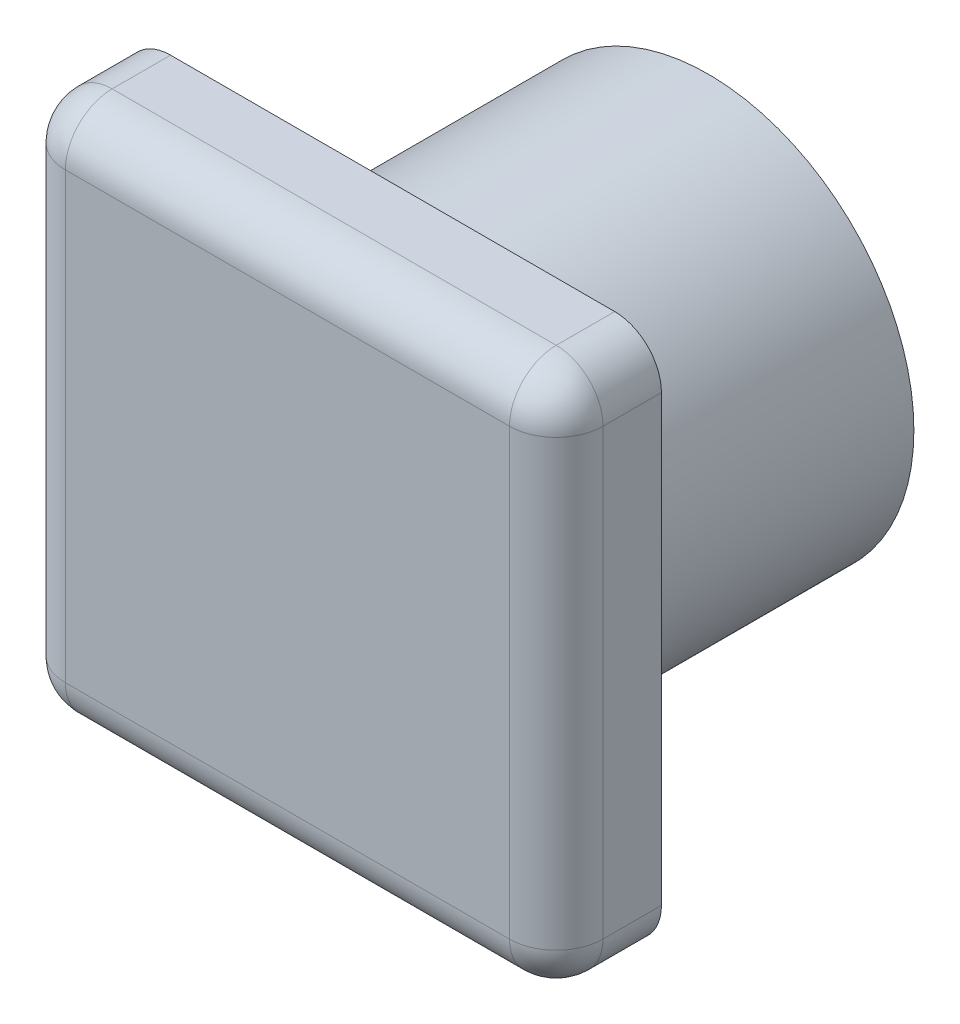
ISO-10303-21;
HEADER;
FILE_DESCRIPTION(('STEP AP214'),'2;1');
FILE_NAME('part.step','',(''),(''),'','','');
FILE_SCHEMA(('AUTOMOTIVE_DESIGN { 1 0 10303 214 1 1 1 1 }'));
ENDSEC;
DATA;
#1=APPLICATION_CONTEXT('core data for automotive mechanical design processes');
#2=APPLICATION_PROTOCOL_DEFINITION('international standard','automotive_design',2000,#1);
#3=PRODUCT_CONTEXT('',#1,'mechanical');
#4=PRODUCT('Part','Part','',(#3));
#5=PRODUCT_RELATED_PRODUCT_CATEGORY('part','',(#4));
#6=PRODUCT_DEFINITION_FORMATION('','',#4);
#7=PRODUCT_DEFINITION_CONTEXT('part definition',#1,'design');
#8=PRODUCT_DEFINITION('design','',#6,#7);
#9=PRODUCT_DEFINITION_SHAPE('','',#8);
#10=(LENGTH_UNIT() NAMED_UNIT(*) SI_UNIT(.MILLI.,.METRE.));
#11=(NAMED_UNIT(*) PLANE_ANGLE_UNIT() SI_UNIT($,.RADIAN.));
#12=(NAMED_UNIT(*) SI_UNIT($,.STERADIAN.) SOLID_ANGLE_UNIT());
#13=UNCERTAINTY_MEASURE_WITH_UNIT(LENGTH_MEASURE(1.E-05),#10,'distance_accuracy_value','');
#14=(GEOMETRIC_REPRESENTATION_CONTEXT(3) GLOBAL_UNCERTAINTY_ASSIGNED_CONTEXT((#13)) GLOBAL_UNIT_ASSIGNED_CONTEXT((#10,
#11,#12)) REPRESENTATION_CONTEXT('',''));
#15=CARTESIAN_POINT('',(0.,0.,0.));
#16=DIRECTION('',(0.,0.,1.));
#17=DIRECTION('',(1.,0.,0.));
#18=AXIS2_PLACEMENT_3D('',#15,#16,#17);
#19=CARTESIAN_POINT('',(0.,0.,13.5));
#20=DIRECTION('',(0.,0.,-1.));
#21=DIRECTION('',(-1.,0.,0.));
#22=AXIS2_PLACEMENT_3D('',#19,#20,#21);
#23=CYLINDRICAL_SURFACE('',#22,8.8);
#24=CARTESIAN_POINT('',(0.,0.,13.5));
#25=DIRECTION('',(0.,0.,1.));
#26=DIRECTION('',(1.,0.,0.));
#27=AXIS2_PLACEMENT_3D('',#24,#25,#26);
#28=CIRCLE('',#27,8.8);
#29=CARTESIAN_POINT('',(8.8,0.,13.5));
#30=VERTEX_POINT('',#29);
#31=EDGE_CURVE('E140',#30,#30,#28,.T.);
#32=ORIENTED_EDGE('',*,*,#31,.F.);
#33=EDGE_LOOP('',(#32));
#34=FACE_BOUND('',#33,.T.);
#35=CARTESIAN_POINT('',(0.,0.,0.));
#36=DIRECTION('',(0.,0.,1.));
#37=DIRECTION('',(1.,0.,0.));
#38=AXIS2_PLACEMENT_3D('',#35,#36,#37);
#39=CIRCLE('',#38,8.8);
#40=CARTESIAN_POINT('',(8.8,0.,0.));
#41=VERTEX_POINT('',#40);
#42=EDGE_CURVE('E212',#41,#41,#39,.T.);
#43=ORIENTED_EDGE('',*,*,#42,.T.);
#44=EDGE_LOOP('',(#43));
#45=FACE_BOUND('',#44,.T.);
#46=ADVANCED_FACE('F33',(#34,#45),#23,.T.);
#47=CARTESIAN_POINT('',(0.,0.,0.));
#48=DIRECTION('',(0.,0.,1.));
#49=DIRECTION('',(1.,0.,0.));
#50=AXIS2_PLACEMENT_3D('',#47,#48,#49);
#51=PLANE('',#50);
#52=ORIENTED_EDGE('',*,*,#42,.F.);
#53=EDGE_LOOP('',(#52));
#54=FACE_BOUND('',#53,.T.);
#55=ADVANCED_FACE('F259',(#54),#51,.F.);
#56=CARTESIAN_POINT('',(11.5,-11.5,18.));
#57=DIRECTION('',(-1.,0.,0.));
#58=DIRECTION('',(0.,0.,1.));
#59=AXIS2_PLACEMENT_3D('',#56,#57,#58);
#60=PLANE('',#59);
#61=DIRECTION('',(0.,1.,0.));
#62=VECTOR('',#61,1.);
#63=CARTESIAN_POINT('',(11.5,-11.5,16.));
#64=LINE('',#63,#62);
#65=CARTESIAN_POINT('',(11.5,9.5,16.));
#66=VERTEX_POINT('',#65);
#67=CARTESIAN_POINT('',(11.5,-9.5,16.));
#68=VERTEX_POINT('',#67);
#69=EDGE_CURVE('E50',#66,#68,#64,.F.);
#70=ORIENTED_EDGE('',*,*,#69,.T.);
#71=DIRECTION('',(0.,0.,-1.));
#72=VECTOR('',#71,1.);
#73=CARTESIAN_POINT('',(11.5,-9.5,18.));
#74=LINE('',#73,#72);
#75=CARTESIAN_POINT('',(11.5,-9.5,13.5));
#76=VERTEX_POINT('',#75);
#77=EDGE_CURVE('E169',#68,#76,#74,.T.);
#78=ORIENTED_EDGE('',*,*,#77,.T.);
#79=DIRECTION('',(0.,1.,0.));
#80=VECTOR('',#79,1.);
#81=CARTESIAN_POINT('',(11.5,-11.5,13.5));
#82=LINE('',#81,#80);
#83=CARTESIAN_POINT('',(11.5,9.5,13.5));
#84=VERTEX_POINT('',#83);
#85=EDGE_CURVE('E198',#76,#84,#82,.T.);
#86=ORIENTED_EDGE('',*,*,#85,.T.);
#87=DIRECTION('',(0.,0.,-1.));
#88=VECTOR('',#87,1.);
#89=CARTESIAN_POINT('',(11.5,9.5,18.));
#90=LINE('',#89,#88);
#91=EDGE_CURVE('E55',#84,#66,#90,.F.);
#92=ORIENTED_EDGE('',*,*,#91,.T.);
#93=EDGE_LOOP('',(#70,#78,#86,#92));
#94=FACE_BOUND('',#93,.T.);
#95=ADVANCED_FACE('F240',(#94),#60,.F.);
#96=CARTESIAN_POINT('',(-11.5,11.5,18.));
#97=DIRECTION('',(0.,-1.,0.));
#98=DIRECTION('',(0.,0.,-1.));
#99=AXIS2_PLACEMENT_3D('',#96,#97,#98);
#100=PLANE('',#99);
#101=DIRECTION('',(-1.,0.,0.));
#102=VECTOR('',#101,1.);
#103=CARTESIAN_POINT('',(-11.5,11.5,13.5));
#104=LINE('',#103,#102);
#105=CARTESIAN_POINT('',(9.5,11.5,13.5));
#106=VERTEX_POINT('',#105);
#107=CARTESIAN_POINT('',(-9.5,11.5,13.5));
#108=VERTEX_POINT('',#107);
#109=EDGE_CURVE('E200',#106,#108,#104,.T.);
#110=ORIENTED_EDGE('',*,*,#109,.T.);
#111=DIRECTION('',(0.,0.,-1.));
#112=VECTOR('',#111,1.);
#113=CARTESIAN_POINT('',(-9.5,11.5,18.));
#114=LINE('',#113,#112);
#115=CARTESIAN_POINT('',(-9.5,11.5,16.));
#116=VERTEX_POINT('',#115);
#117=EDGE_CURVE('E165',#108,#116,#114,.F.);
#118=ORIENTED_EDGE('',*,*,#117,.T.);
#119=DIRECTION('',(-1.,0.,0.));
#120=VECTOR('',#119,1.);
#121=CARTESIAN_POINT('',(-11.5,11.5,16.));
#122=LINE('',#121,#120);
#123=CARTESIAN_POINT('',(9.5,11.5,16.));
#124=VERTEX_POINT('',#123);
#125=EDGE_CURVE('E163',#116,#124,#122,.F.);
#126=ORIENTED_EDGE('',*,*,#125,.T.);
#127=DIRECTION('',(0.,0.,-1.));
#128=VECTOR('',#127,1.);
#129=CARTESIAN_POINT('',(9.5,11.5,18.));
#130=LINE('',#129,#128);
#131=EDGE_CURVE('E161',#124,#106,#130,.T.);
#132=ORIENTED_EDGE('',*,*,#131,.T.);
#133=EDGE_LOOP('',(#110,#118,#126,#132));
#134=FACE_BOUND('',#133,.T.);
#135=ADVANCED_FACE('F382',(#134),#100,.F.);
#136=CARTESIAN_POINT('',(-11.5,-11.5,18.));
#137=DIRECTION('',(1.,0.,0.));
#138=DIRECTION('',(0.,0.,-1.));
#139=AXIS2_PLACEMENT_3D('',#136,#137,#138);
#140=PLANE('',#139);
#141=DIRECTION('',(0.,-1.,0.));
#142=VECTOR('',#141,1.);
#143=CARTESIAN_POINT('',(-11.5,-11.5,16.));
#144=LINE('',#143,#142);
#145=CARTESIAN_POINT('',(-11.5,-9.5,16.));
#146=VERTEX_POINT('',#145);
#147=CARTESIAN_POINT('',(-11.5,9.5,16.));
#148=VERTEX_POINT('',#147);
#149=EDGE_CURVE('E157',#146,#148,#144,.F.);
#150=ORIENTED_EDGE('',*,*,#149,.T.);
#151=DIRECTION('',(0.,0.,-1.));
#152=VECTOR('',#151,1.);
#153=CARTESIAN_POINT('',(-11.5,9.5,18.));
#154=LINE('',#153,#152);
#155=CARTESIAN_POINT('',(-11.5,9.5,13.5));
#156=VERTEX_POINT('',#155);
#157=EDGE_CURVE('E159',#148,#156,#154,.T.);
#158=ORIENTED_EDGE('',*,*,#157,.T.);
#159=DIRECTION('',(0.,-1.,0.));
#160=VECTOR('',#159,1.);
#161=CARTESIAN_POINT('',(-11.5,-11.5,13.5));
#162=LINE('',#161,#160);
#163=CARTESIAN_POINT('',(-11.5,-9.5,13.5));
#164=VERTEX_POINT('',#163);
#165=EDGE_CURVE('E204',#156,#164,#162,.T.);
#166=ORIENTED_EDGE('',*,*,#165,.T.);
#167=DIRECTION('',(0.,0.,-1.));
#168=VECTOR('',#167,1.);
#169=CARTESIAN_POINT('',(-11.5,-9.5,18.));
#170=LINE('',#169,#168);
#171=EDGE_CURVE('E155',#164,#146,#170,.F.);
#172=ORIENTED_EDGE('',*,*,#171,.T.);
#173=EDGE_LOOP('',(#150,#158,#166,#172));
#174=FACE_BOUND('',#173,.T.);
#175=ADVANCED_FACE('F374',(#174),#140,.F.);
#176=CARTESIAN_POINT('',(-11.5,-11.5,18.));
#177=DIRECTION('',(0.,1.,0.));
#178=DIRECTION('',(0.,0.,1.));
#179=AXIS2_PLACEMENT_3D('',#176,#177,#178);
#180=PLANE('',#179);
#181=DIRECTION('',(1.,0.,0.));
#182=VECTOR('',#181,1.);
#183=CARTESIAN_POINT('',(-11.5,-11.5,13.5));
#184=LINE('',#183,#182);
#185=CARTESIAN_POINT('',(-9.5,-11.5,13.5));
#186=VERTEX_POINT('',#185);
#187=CARTESIAN_POINT('',(9.5,-11.5,13.5));
#188=VERTEX_POINT('',#187);
#189=EDGE_CURVE('E209',#186,#188,#184,.T.);
#190=ORIENTED_EDGE('',*,*,#189,.T.);
#191=DIRECTION('',(0.,0.,-1.));
#192=VECTOR('',#191,1.);
#193=CARTESIAN_POINT('',(9.5,-11.5,18.));
#194=LINE('',#193,#192);
#195=CARTESIAN_POINT('',(9.5,-11.5,16.));
#196=VERTEX_POINT('',#195);
#197=EDGE_CURVE('E153',#188,#196,#194,.F.);
#198=ORIENTED_EDGE('',*,*,#197,.T.);
#199=DIRECTION('',(1.,0.,0.));
#200=VECTOR('',#199,1.);
#201=CARTESIAN_POINT('',(-11.5,-11.5,16.));
#202=LINE('',#201,#200);
#203=CARTESIAN_POINT('',(-9.5,-11.5,16.));
#204=VERTEX_POINT('',#203);
#205=EDGE_CURVE('E118',#196,#204,#202,.F.);
#206=ORIENTED_EDGE('',*,*,#205,.T.);
#207=DIRECTION('',(0.,0.,-1.));
#208=VECTOR('',#207,1.);
#209=CARTESIAN_POINT('',(-9.5,-11.5,18.));
#210=LINE('',#209,#208);
#211=EDGE_CURVE('E146',#204,#186,#210,.T.);
#212=ORIENTED_EDGE('',*,*,#211,.T.);
#213=EDGE_LOOP('',(#190,#198,#206,#212));
#214=FACE_BOUND('',#213,.T.);
#215=ADVANCED_FACE('F235',(#214),#180,.F.);
#216=CARTESIAN_POINT('',(0.,0.,18.));
#217=DIRECTION('',(0.,0.,-1.));
#218=DIRECTION('',(-1.,0.,0.));
#219=AXIS2_PLACEMENT_3D('',#216,#217,#218);
#220=PLANE('',#219);
#221=DIRECTION('',(0.,-1.,0.));
#222=VECTOR('',#221,1.);
#223=CARTESIAN_POINT('',(-9.5,0.,18.));
#224=LINE('',#223,#222);
#225=CARTESIAN_POINT('',(-9.5,9.5,18.));
#226=VERTEX_POINT('',#225);
#227=CARTESIAN_POINT('',(-9.5,-9.5,18.));
#228=VERTEX_POINT('',#227);
#229=EDGE_CURVE('E144',#226,#228,#224,.T.);
#230=ORIENTED_EDGE('',*,*,#229,.T.);
#231=DIRECTION('',(1.,0.,0.));
#232=VECTOR('',#231,1.);
#233=CARTESIAN_POINT('',(0.,-9.5,18.));
#234=LINE('',#233,#232);
#235=CARTESIAN_POINT('',(9.5,-9.5,18.));
#236=VERTEX_POINT('',#235);
#237=EDGE_CURVE('E116',#228,#236,#234,.T.);
#238=ORIENTED_EDGE('',*,*,#237,.T.);
#239=DIRECTION('',(0.,1.,0.));
#240=VECTOR('',#239,1.);
#241=CARTESIAN_POINT('',(9.5,0.,18.));
#242=LINE('',#241,#240);
#243=CARTESIAN_POINT('',(9.5,9.5,18.));
#244=VERTEX_POINT('',#243);
#245=EDGE_CURVE('E133',#236,#244,#242,.T.);
#246=ORIENTED_EDGE('',*,*,#245,.T.);
#247=DIRECTION('',(-1.,0.,0.));
#248=VECTOR('',#247,1.);
#249=CARTESIAN_POINT('',(0.,9.5,18.));
#250=LINE('',#249,#248);
#251=EDGE_CURVE('E139',#244,#226,#250,.T.);
#252=ORIENTED_EDGE('',*,*,#251,.T.);
#253=EDGE_LOOP('',(#230,#238,#246,#252));
#254=FACE_BOUND('',#253,.T.);
#255=ADVANCED_FACE('F142',(#254),#220,.F.);
#256=CARTESIAN_POINT('',(0.,0.,13.5));
#257=DIRECTION('',(0.,0.,-1.));
#258=DIRECTION('',(-1.,0.,0.));
#259=AXIS2_PLACEMENT_3D('',#256,#257,#258);
#260=PLANE('',#259);
#261=ORIENTED_EDGE('',*,*,#31,.T.);
#262=EDGE_LOOP('',(#261));
#263=FACE_BOUND('',#262,.T.);
#264=ORIENTED_EDGE('',*,*,#85,.F.);
#265=CARTESIAN_POINT('',(9.5,-9.5,13.5));
#266=DIRECTION('',(0.,0.,-1.));
#267=DIRECTION('',(-1.,0.,0.));
#268=AXIS2_PLACEMENT_3D('',#265,#266,#267);
#269=CIRCLE('',#268,2.);
#270=EDGE_CURVE('E11',#76,#188,#269,.T.);
#271=ORIENTED_EDGE('',*,*,#270,.T.);
#272=ORIENTED_EDGE('',*,*,#189,.F.);
#273=CARTESIAN_POINT('',(-9.5,-9.5,13.5));
#274=DIRECTION('',(0.,0.,-1.));
#275=DIRECTION('',(-1.,0.,0.));
#276=AXIS2_PLACEMENT_3D('',#273,#274,#275);
#277=CIRCLE('',#276,2.);
#278=EDGE_CURVE('E173',#186,#164,#277,.T.);
#279=ORIENTED_EDGE('',*,*,#278,.T.);
#280=ORIENTED_EDGE('',*,*,#165,.F.);
#281=CARTESIAN_POINT('',(-9.5,9.5,13.5));
#282=DIRECTION('',(0.,0.,-1.));
#283=DIRECTION('',(-1.,0.,0.));
#284=AXIS2_PLACEMENT_3D('',#281,#282,#283);
#285=CIRCLE('',#284,2.);
#286=EDGE_CURVE('E42',#156,#108,#285,.T.);
#287=ORIENTED_EDGE('',*,*,#286,.T.);
#288=ORIENTED_EDGE('',*,*,#109,.F.);
#289=CARTESIAN_POINT('',(9.5,9.5,13.5));
#290=DIRECTION('',(0.,0.,-1.));
#291=DIRECTION('',(-1.,0.,0.));
#292=AXIS2_PLACEMENT_3D('',#289,#290,#291);
#293=CIRCLE('',#292,2.);
#294=EDGE_CURVE('E171',#106,#84,#293,.T.);
#295=ORIENTED_EDGE('',*,*,#294,.T.);
#296=EDGE_LOOP('',(#264,#271,#272,#279,#280,#287,#288,#295));
#297=FACE_BOUND('',#296,.T.);
#298=ADVANCED_FACE('F242',(#263,#297),#260,.T.);
#299=CARTESIAN_POINT('',(-9.5,9.5,18.));
#300=DIRECTION('',(0.,0.,-1.));
#301=DIRECTION('',(-1.,0.,0.));
#302=AXIS2_PLACEMENT_3D('',#299,#300,#301);
#303=CYLINDRICAL_SURFACE('',#302,2.);
#304=ORIENTED_EDGE('',*,*,#286,.F.);
#305=ORIENTED_EDGE('',*,*,#157,.F.);
#306=CARTESIAN_POINT('',(-9.5,9.5,16.));
#307=DIRECTION('',(0.,0.,1.));
#308=DIRECTION('',(1.,0.,0.));
#309=AXIS2_PLACEMENT_3D('',#306,#307,#308);
#310=CIRCLE('',#309,2.);
#311=EDGE_CURVE('E37',#116,#148,#310,.T.);
#312=ORIENTED_EDGE('',*,*,#311,.F.);
#313=ORIENTED_EDGE('',*,*,#117,.F.);
#314=EDGE_LOOP('',(#304,#305,#312,#313));
#315=FACE_BOUND('',#314,.T.);
#316=ADVANCED_FACE('F35',(#315),#303,.T.);
#317=CARTESIAN_POINT('',(0.,9.5,16.));
#318=DIRECTION('',(-1.,0.,0.));
#319=DIRECTION('',(0.,0.,1.));
#320=AXIS2_PLACEMENT_3D('',#317,#318,#319);
#321=CYLINDRICAL_SURFACE('',#320,2.);
#322=CARTESIAN_POINT('',(9.5,9.5,16.));
#323=DIRECTION('',(1.,0.,0.));
#324=DIRECTION('',(0.,0.,-1.));
#325=AXIS2_PLACEMENT_3D('',#322,#323,#324);
#326=CIRCLE('',#325,2.);
#327=EDGE_CURVE('E190',#124,#244,#326,.T.);
#328=ORIENTED_EDGE('',*,*,#327,.F.);
#329=ORIENTED_EDGE('',*,*,#125,.F.);
#330=CARTESIAN_POINT('',(-9.5,9.5,16.));
#331=DIRECTION('',(-1.,0.,0.));
#332=DIRECTION('',(0.,0.,1.));
#333=AXIS2_PLACEMENT_3D('',#330,#331,#332);
#334=CIRCLE('',#333,2.);
#335=EDGE_CURVE('E192',#226,#116,#334,.T.);
#336=ORIENTED_EDGE('',*,*,#335,.F.);
#337=ORIENTED_EDGE('',*,*,#251,.F.);
#338=EDGE_LOOP('',(#328,#329,#336,#337));
#339=FACE_BOUND('',#338,.T.);
#340=ADVANCED_FACE('F219',(#339),#321,.T.);
#341=CARTESIAN_POINT('',(9.5,9.5,18.));
#342=DIRECTION('',(0.,0.,-1.));
#343=DIRECTION('',(-1.,0.,0.));
#344=AXIS2_PLACEMENT_3D('',#341,#342,#343);
#345=CYLINDRICAL_SURFACE('',#344,2.);
#346=ORIENTED_EDGE('',*,*,#294,.F.);
#347=ORIENTED_EDGE('',*,*,#131,.F.);
#348=CARTESIAN_POINT('',(9.5,9.5,16.));
#349=DIRECTION('',(0.,0.,1.));
#350=DIRECTION('',(1.,0.,0.));
#351=AXIS2_PLACEMENT_3D('',#348,#349,#350);
#352=CIRCLE('',#351,2.);
#353=EDGE_CURVE('E187',#66,#124,#352,.T.);
#354=ORIENTED_EDGE('',*,*,#353,.F.);
#355=ORIENTED_EDGE('',*,*,#91,.F.);
#356=EDGE_LOOP('',(#346,#347,#354,#355));
#357=FACE_BOUND('',#356,.T.);
#358=ADVANCED_FACE('F247',(#357),#345,.T.);
#359=CARTESIAN_POINT('',(-9.5,9.5,16.));
#360=DIRECTION('',(0.,0.,1.));
#361=DIRECTION('',(1.,0.,0.));
#362=AXIS2_PLACEMENT_3D('',#359,#360,#361);
#363=SPHERICAL_SURFACE('',#362,2.);
#364=ORIENTED_EDGE('',*,*,#335,.T.);
#365=ORIENTED_EDGE('',*,*,#311,.T.);
#366=CARTESIAN_POINT('',(-9.5,9.5,16.));
#367=DIRECTION('',(0.,1.,0.));
#368=DIRECTION('',(0.,0.,1.));
#369=AXIS2_PLACEMENT_3D('',#366,#367,#368);
#370=CIRCLE('',#369,2.);
#371=EDGE_CURVE('E184',#226,#148,#370,.F.);
#372=ORIENTED_EDGE('',*,*,#371,.F.);
#373=EDGE_LOOP('',(#364,#365,#372));
#374=FACE_BOUND('',#373,.T.);
#375=ADVANCED_FACE('F220',(#374),#363,.T.);
#376=CARTESIAN_POINT('',(9.5,9.5,16.));
#377=DIRECTION('',(0.,0.,1.));
#378=DIRECTION('',(1.,0.,0.));
#379=AXIS2_PLACEMENT_3D('',#376,#377,#378);
#380=SPHERICAL_SURFACE('',#379,2.);
#381=ORIENTED_EDGE('',*,*,#353,.T.);
#382=ORIENTED_EDGE('',*,*,#327,.T.);
#383=CARTESIAN_POINT('',(9.5,9.5,16.));
#384=DIRECTION('',(0.,1.,0.));
#385=DIRECTION('',(0.,0.,1.));
#386=AXIS2_PLACEMENT_3D('',#383,#384,#385);
#387=CIRCLE('',#386,2.);
#388=EDGE_CURVE('E136',#66,#244,#387,.F.);
#389=ORIENTED_EDGE('',*,*,#388,.F.);
#390=EDGE_LOOP('',(#381,#382,#389));
#391=FACE_BOUND('',#390,.T.);
#392=ADVANCED_FACE('F249',(#391),#380,.T.);
#393=CARTESIAN_POINT('',(-9.5,-9.5,18.));
#394=DIRECTION('',(0.,0.,-1.));
#395=DIRECTION('',(-1.,0.,0.));
#396=AXIS2_PLACEMENT_3D('',#393,#394,#395);
#397=CYLINDRICAL_SURFACE('',#396,2.);
#398=ORIENTED_EDGE('',*,*,#278,.F.);
#399=ORIENTED_EDGE('',*,*,#211,.F.);
#400=CARTESIAN_POINT('',(-9.5,-9.5,16.));
#401=DIRECTION('',(0.,0.,1.));
#402=DIRECTION('',(1.,0.,0.));
#403=AXIS2_PLACEMENT_3D('',#400,#401,#402);
#404=CIRCLE('',#403,2.);
#405=EDGE_CURVE('E180',#146,#204,#404,.T.);
#406=ORIENTED_EDGE('',*,*,#405,.F.);
#407=ORIENTED_EDGE('',*,*,#171,.F.);
#408=EDGE_LOOP('',(#398,#399,#406,#407));
#409=FACE_BOUND('',#408,.T.);
#410=ADVANCED_FACE('F232',(#409),#397,.T.);
#411=CARTESIAN_POINT('',(-9.5,0.,16.));
#412=DIRECTION('',(0.,-1.,0.));
#413=DIRECTION('',(0.,0.,-1.));
#414=AXIS2_PLACEMENT_3D('',#411,#412,#413);
#415=CYLINDRICAL_SURFACE('',#414,2.);
#416=ORIENTED_EDGE('',*,*,#371,.T.);
#417=ORIENTED_EDGE('',*,*,#149,.F.);
#418=CARTESIAN_POINT('',(-9.5,-9.5,16.));
#419=DIRECTION('',(0.,-1.,0.));
#420=DIRECTION('',(0.,0.,-1.));
#421=AXIS2_PLACEMENT_3D('',#418,#419,#420);
#422=CIRCLE('',#421,2.);
#423=EDGE_CURVE('E130',#228,#146,#422,.T.);
#424=ORIENTED_EDGE('',*,*,#423,.F.);
#425=ORIENTED_EDGE('',*,*,#229,.F.);
#426=EDGE_LOOP('',(#416,#417,#424,#425));
#427=FACE_BOUND('',#426,.T.);
#428=ADVANCED_FACE('F223',(#427),#415,.T.);
#429=CARTESIAN_POINT('',(9.5,0.,16.));
#430=DIRECTION('',(0.,1.,0.));
#431=DIRECTION('',(0.,0.,1.));
#432=AXIS2_PLACEMENT_3D('',#429,#430,#431);
#433=CYLINDRICAL_SURFACE('',#432,2.);
#434=ORIENTED_EDGE('',*,*,#388,.T.);
#435=ORIENTED_EDGE('',*,*,#245,.F.);
#436=CARTESIAN_POINT('',(9.5,-9.5,16.));
#437=DIRECTION('',(0.,-1.,0.));
#438=DIRECTION('',(0.,0.,-1.));
#439=AXIS2_PLACEMENT_3D('',#436,#437,#438);
#440=CIRCLE('',#439,2.);
#441=EDGE_CURVE('E124',#68,#236,#440,.T.);
#442=ORIENTED_EDGE('',*,*,#441,.F.);
#443=ORIENTED_EDGE('',*,*,#69,.F.);
#444=EDGE_LOOP('',(#434,#435,#442,#443));
#445=FACE_BOUND('',#444,.T.);
#446=ADVANCED_FACE('F134',(#445),#433,.T.);
#447=CARTESIAN_POINT('',(9.5,-9.5,18.));
#448=DIRECTION('',(0.,0.,-1.));
#449=DIRECTION('',(-1.,0.,0.));
#450=AXIS2_PLACEMENT_3D('',#447,#448,#449);
#451=CYLINDRICAL_SURFACE('',#450,2.);
#452=ORIENTED_EDGE('',*,*,#270,.F.);
#453=ORIENTED_EDGE('',*,*,#77,.F.);
#454=CARTESIAN_POINT('',(9.5,-9.5,16.));
#455=DIRECTION('',(0.,0.,1.));
#456=DIRECTION('',(1.,0.,0.));
#457=AXIS2_PLACEMENT_3D('',#454,#455,#456);
#458=CIRCLE('',#457,2.);
#459=EDGE_CURVE('E128',#196,#68,#458,.T.);
#460=ORIENTED_EDGE('',*,*,#459,.F.);
#461=ORIENTED_EDGE('',*,*,#197,.F.);
#462=EDGE_LOOP('',(#452,#453,#460,#461));
#463=FACE_BOUND('',#462,.T.);
#464=ADVANCED_FACE('F239',(#463),#451,.T.);
#465=CARTESIAN_POINT('',(-9.5,-9.5,16.));
#466=DIRECTION('',(0.,0.,1.));
#467=DIRECTION('',(1.,0.,0.));
#468=AXIS2_PLACEMENT_3D('',#465,#466,#467);
#469=SPHERICAL_SURFACE('',#468,2.);
#470=ORIENTED_EDGE('',*,*,#423,.T.);
#471=ORIENTED_EDGE('',*,*,#405,.T.);
#472=CARTESIAN_POINT('',(-9.5,-9.5,16.));
#473=DIRECTION('',(-1.,0.,0.));
#474=DIRECTION('',(0.,0.,1.));
#475=AXIS2_PLACEMENT_3D('',#472,#473,#474);
#476=CIRCLE('',#475,2.);
#477=EDGE_CURVE('E121',#228,#204,#476,.F.);
#478=ORIENTED_EDGE('',*,*,#477,.F.);
#479=EDGE_LOOP('',(#470,#471,#478));
#480=FACE_BOUND('',#479,.T.);
#481=ADVANCED_FACE('F227',(#480),#469,.T.);
#482=CARTESIAN_POINT('',(9.5,-9.5,16.));
#483=DIRECTION('',(0.,0.,1.));
#484=DIRECTION('',(1.,0.,0.));
#485=AXIS2_PLACEMENT_3D('',#482,#483,#484);
#486=SPHERICAL_SURFACE('',#485,2.);
#487=ORIENTED_EDGE('',*,*,#459,.T.);
#488=ORIENTED_EDGE('',*,*,#441,.T.);
#489=CARTESIAN_POINT('',(9.5,-9.5,16.));
#490=DIRECTION('',(1.,0.,0.));
#491=DIRECTION('',(0.,0.,-1.));
#492=AXIS2_PLACEMENT_3D('',#489,#490,#491);
#493=CIRCLE('',#492,2.);
#494=EDGE_CURVE('E112',#196,#236,#493,.F.);
#495=ORIENTED_EDGE('',*,*,#494,.F.);
#496=EDGE_LOOP('',(#487,#488,#495));
#497=FACE_BOUND('',#496,.T.);
#498=ADVANCED_FACE('F126',(#497),#486,.T.);
#499=CARTESIAN_POINT('',(0.,-9.5,16.));
#500=DIRECTION('',(1.,0.,0.));
#501=DIRECTION('',(0.,0.,-1.));
#502=AXIS2_PLACEMENT_3D('',#499,#500,#501);
#503=CYLINDRICAL_SURFACE('',#502,2.);
#504=ORIENTED_EDGE('',*,*,#477,.T.);
#505=ORIENTED_EDGE('',*,*,#205,.F.);
#506=ORIENTED_EDGE('',*,*,#494,.T.);
#507=ORIENTED_EDGE('',*,*,#237,.F.);
#508=EDGE_LOOP('',(#504,#505,#506,#507));
#509=FACE_BOUND('',#508,.T.);
#510=ADVANCED_FACE('F114',(#509),#503,.T.);
#511=CLOSED_SHELL('',(#46,#55,#95,#135,#175,#215,#255,#298,#316,#340,#358,#375,#392,#410,#428,
#446,#464,#481,#498,#510));
#512=MANIFOLD_SOLID_BREP('B2',#511);
#513=ADVANCED_BREP_SHAPE_REPRESENTATION('',(#18,#512),#14);
#514=SHAPE_DEFINITION_REPRESENTATION(#9,#513);
ENDSEC;
END-ISO-10303-21;
